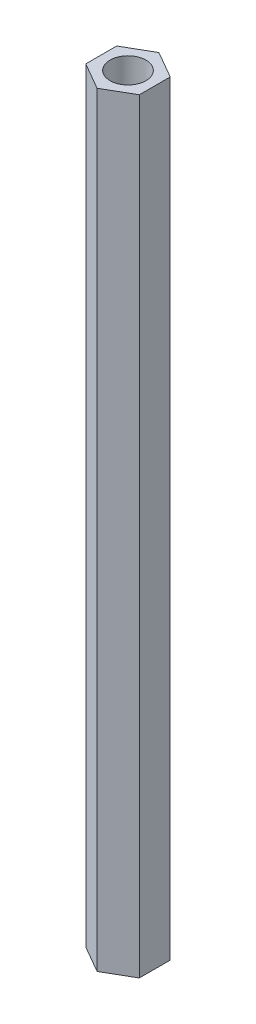
ISO-10303-21;
HEADER;
FILE_DESCRIPTION(('STEP AP214'),'2;1');
FILE_NAME('part.step','',(''),(''),'','','');
FILE_SCHEMA(('AUTOMOTIVE_DESIGN { 1 0 10303 214 1 1 1 1 }'));
ENDSEC;
DATA;
#1=APPLICATION_CONTEXT('core data for automotive mechanical design processes');
#2=APPLICATION_PROTOCOL_DEFINITION('international standard','automotive_design',2000,#1);
#3=PRODUCT_CONTEXT('',#1,'mechanical');
#4=PRODUCT('Part','Part','',(#3));
#5=PRODUCT_RELATED_PRODUCT_CATEGORY('part','',(#4));
#6=PRODUCT_DEFINITION_FORMATION('','',#4);
#7=PRODUCT_DEFINITION_CONTEXT('part definition',#1,'design');
#8=PRODUCT_DEFINITION('design','',#6,#7);
#9=PRODUCT_DEFINITION_SHAPE('','',#8);
#10=(LENGTH_UNIT() NAMED_UNIT(*) SI_UNIT(.MILLI.,.METRE.));
#11=(NAMED_UNIT(*) PLANE_ANGLE_UNIT() SI_UNIT($,.RADIAN.));
#12=(NAMED_UNIT(*) SI_UNIT($,.STERADIAN.) SOLID_ANGLE_UNIT());
#13=UNCERTAINTY_MEASURE_WITH_UNIT(LENGTH_MEASURE(1.E-05),#10,'distance_accuracy_value','');
#14=(GEOMETRIC_REPRESENTATION_CONTEXT(3) GLOBAL_UNCERTAINTY_ASSIGNED_CONTEXT((#13)) GLOBAL_UNIT_ASSIGNED_CONTEXT((#10,
#11,#12)) REPRESENTATION_CONTEXT('',''));
#15=CARTESIAN_POINT('',(0.,0.,0.));
#16=DIRECTION('',(0.,0.,1.));
#17=DIRECTION('',(1.,0.,0.));
#18=AXIS2_PLACEMENT_3D('',#15,#16,#17);
#19=CARTESIAN_POINT('',(0.,50.8,0.));
#20=DIRECTION('',(0.,1.,0.));
#21=DIRECTION('',(0.,0.,1.));
#22=AXIS2_PLACEMENT_3D('',#19,#20,#21);
#23=PLANE('',#22);
#24=DIRECTION('',(0.866025403784438,0.,0.5));
#25=VECTOR('',#24,1.);
#26=CARTESIAN_POINT('',(-1.778,50.8,1.02652877861915));
#27=LINE('',#26,#25);
#28=CARTESIAN_POINT('',(-1.778,50.8,1.02652877861915));
#29=VERTEX_POINT('',#28);
#30=CARTESIAN_POINT('',(0.,50.8,2.05305755723831));
#31=VERTEX_POINT('',#30);
#32=EDGE_CURVE('E129',#29,#31,#27,.T.);
#33=ORIENTED_EDGE('',*,*,#32,.T.);
#34=DIRECTION('',(0.866025403784439,0.,-0.5));
#35=VECTOR('',#34,1.);
#36=CARTESIAN_POINT('',(0.,50.8,2.05305755723831));
#37=LINE('',#36,#35);
#38=CARTESIAN_POINT('',(1.778,50.8,1.02652877861915));
#39=VERTEX_POINT('',#38);
#40=EDGE_CURVE('E87',#31,#39,#37,.T.);
#41=ORIENTED_EDGE('',*,*,#40,.T.);
#42=DIRECTION('',(0.,0.,-1.));
#43=VECTOR('',#42,1.);
#44=CARTESIAN_POINT('',(1.778,50.8,1.02652877861915));
#45=LINE('',#44,#43);
#46=CARTESIAN_POINT('',(1.778,50.8,-1.02652877861915));
#47=VERTEX_POINT('',#46);
#48=EDGE_CURVE('E100',#39,#47,#45,.T.);
#49=ORIENTED_EDGE('',*,*,#48,.T.);
#50=DIRECTION('',(-0.866025403784439,0.,-0.5));
#51=VECTOR('',#50,1.);
#52=CARTESIAN_POINT('',(1.778,50.8,-1.02652877861915));
#53=LINE('',#52,#51);
#54=CARTESIAN_POINT('',(0.,50.8,-2.05305755723831));
#55=VERTEX_POINT('',#54);
#56=EDGE_CURVE('E94',#47,#55,#53,.T.);
#57=ORIENTED_EDGE('',*,*,#56,.T.);
#58=DIRECTION('',(-0.866025403784439,0.,0.5));
#59=VECTOR('',#58,1.);
#60=CARTESIAN_POINT('',(0.,50.8,-2.05305755723831));
#61=LINE('',#60,#59);
#62=CARTESIAN_POINT('',(-1.778,50.8,-1.02652877861915));
#63=VERTEX_POINT('',#62);
#64=EDGE_CURVE('E98',#55,#63,#61,.T.);
#65=ORIENTED_EDGE('',*,*,#64,.T.);
#66=DIRECTION('',(0.,0.,1.));
#67=VECTOR('',#66,1.);
#68=CARTESIAN_POINT('',(-1.778,50.8,-1.02652877861915));
#69=LINE('',#68,#67);
#70=EDGE_CURVE('E50',#63,#29,#69,.T.);
#71=ORIENTED_EDGE('',*,*,#70,.T.);
#72=EDGE_LOOP('',(#33,#41,#49,#57,#65,#71));
#73=FACE_BOUND('',#72,.T.);
#74=CARTESIAN_POINT('',(0.,50.8,0.));
#75=DIRECTION('',(0.,1.,0.));
#76=DIRECTION('',(0.,0.,1.));
#77=AXIS2_PLACEMENT_3D('',#74,#75,#76);
#78=CIRCLE('',#77,1.190625);
#79=CARTESIAN_POINT('',(0.,50.8,1.190625));
#80=VERTEX_POINT('',#79);
#81=EDGE_CURVE('E122',#80,#80,#78,.T.);
#82=ORIENTED_EDGE('',*,*,#81,.F.);
#83=EDGE_LOOP('',(#82));
#84=FACE_BOUND('',#83,.T.);
#85=ADVANCED_FACE('F33',(#73,#84),#23,.T.);
#86=CARTESIAN_POINT('',(0.,0.,0.));
#87=DIRECTION('',(0.,1.,0.));
#88=DIRECTION('',(0.,0.,1.));
#89=AXIS2_PLACEMENT_3D('',#86,#87,#88);
#90=PLANE('',#89);
#91=DIRECTION('',(0.866025403784438,0.,0.5));
#92=VECTOR('',#91,1.);
#93=CARTESIAN_POINT('',(-1.778,0.,1.02652877861915));
#94=LINE('',#93,#92);
#95=CARTESIAN_POINT('',(-1.778,0.,1.02652877861915));
#96=VERTEX_POINT('',#95);
#97=CARTESIAN_POINT('',(0.,0.,2.05305755723831));
#98=VERTEX_POINT('',#97);
#99=EDGE_CURVE('E118',#96,#98,#94,.T.);
#100=ORIENTED_EDGE('',*,*,#99,.F.);
#101=DIRECTION('',(0.,0.,1.));
#102=VECTOR('',#101,1.);
#103=CARTESIAN_POINT('',(-1.778,0.,-1.02652877861915));
#104=LINE('',#103,#102);
#105=CARTESIAN_POINT('',(-1.778,0.,-1.02652877861915));
#106=VERTEX_POINT('',#105);
#107=EDGE_CURVE('E79',#106,#96,#104,.T.);
#108=ORIENTED_EDGE('',*,*,#107,.F.);
#109=DIRECTION('',(-0.866025403784439,0.,0.5));
#110=VECTOR('',#109,1.);
#111=CARTESIAN_POINT('',(0.,0.,-2.05305755723831));
#112=LINE('',#111,#110);
#113=CARTESIAN_POINT('',(0.,0.,-2.05305755723831));
#114=VERTEX_POINT('',#113);
#115=EDGE_CURVE('E73',#114,#106,#112,.T.);
#116=ORIENTED_EDGE('',*,*,#115,.F.);
#117=DIRECTION('',(-0.866025403784439,0.,-0.5));
#118=VECTOR('',#117,1.);
#119=CARTESIAN_POINT('',(1.778,0.,-1.02652877861915));
#120=LINE('',#119,#118);
#121=CARTESIAN_POINT('',(1.778,0.,-1.02652877861915));
#122=VERTEX_POINT('',#121);
#123=EDGE_CURVE('E108',#122,#114,#120,.T.);
#124=ORIENTED_EDGE('',*,*,#123,.F.);
#125=DIRECTION('',(0.,0.,-1.));
#126=VECTOR('',#125,1.);
#127=CARTESIAN_POINT('',(1.778,0.,1.02652877861915));
#128=LINE('',#127,#126);
#129=CARTESIAN_POINT('',(1.778,0.,1.02652877861915));
#130=VERTEX_POINT('',#129);
#131=EDGE_CURVE('E124',#130,#122,#128,.T.);
#132=ORIENTED_EDGE('',*,*,#131,.F.);
#133=DIRECTION('',(0.866025403784439,0.,-0.5));
#134=VECTOR('',#133,1.);
#135=CARTESIAN_POINT('',(0.,0.,2.05305755723831));
#136=LINE('',#135,#134);
#137=EDGE_CURVE('E121',#98,#130,#136,.T.);
#138=ORIENTED_EDGE('',*,*,#137,.F.);
#139=EDGE_LOOP('',(#100,#108,#116,#124,#132,#138));
#140=FACE_BOUND('',#139,.T.);
#141=CARTESIAN_POINT('',(0.,0.,0.));
#142=DIRECTION('',(0.,1.,0.));
#143=DIRECTION('',(0.,0.,1.));
#144=AXIS2_PLACEMENT_3D('',#141,#142,#143);
#145=CIRCLE('',#144,1.190625);
#146=CARTESIAN_POINT('',(0.,0.,1.190625));
#147=VERTEX_POINT('',#146);
#148=EDGE_CURVE('E222',#147,#147,#145,.T.);
#149=ORIENTED_EDGE('',*,*,#148,.T.);
#150=EDGE_LOOP('',(#149));
#151=FACE_BOUND('',#150,.T.);
#152=ADVANCED_FACE('F138',(#140,#151),#90,.F.);
#153=CARTESIAN_POINT('',(-1.778,50.8,1.02652877861915));
#154=DIRECTION('',(0.5,0.,-0.866025403784438));
#155=DIRECTION('',(-0.866025403784439,0.,-0.5));
#156=AXIS2_PLACEMENT_3D('',#153,#154,#155);
#157=PLANE('',#156);
#158=ORIENTED_EDGE('',*,*,#99,.T.);
#159=DIRECTION('',(0.,-1.,0.));
#160=VECTOR('',#159,1.);
#161=CARTESIAN_POINT('',(0.,50.8,2.05305755723831));
#162=LINE('',#161,#160);
#163=EDGE_CURVE('E11',#31,#98,#162,.T.);
#164=ORIENTED_EDGE('',*,*,#163,.F.);
#165=ORIENTED_EDGE('',*,*,#32,.F.);
#166=DIRECTION('',(0.,-1.,0.));
#167=VECTOR('',#166,1.);
#168=CARTESIAN_POINT('',(-1.778,50.8,1.02652877861915));
#169=LINE('',#168,#167);
#170=EDGE_CURVE('E114',#29,#96,#169,.T.);
#171=ORIENTED_EDGE('',*,*,#170,.T.);
#172=EDGE_LOOP('',(#158,#164,#165,#171));
#173=FACE_BOUND('',#172,.T.);
#174=ADVANCED_FACE('F35',(#173),#157,.F.);
#175=CARTESIAN_POINT('',(0.,50.8,2.05305755723831));
#176=DIRECTION('',(-0.5,0.,-0.866025403784439));
#177=DIRECTION('',(-0.866025403784439,0.,0.5));
#178=AXIS2_PLACEMENT_3D('',#175,#176,#177);
#179=PLANE('',#178);
#180=ORIENTED_EDGE('',*,*,#137,.T.);
#181=DIRECTION('',(0.,-1.,0.));
#182=VECTOR('',#181,1.);
#183=CARTESIAN_POINT('',(1.778,50.8,1.02652877861915));
#184=LINE('',#183,#182);
#185=EDGE_CURVE('E42',#39,#130,#184,.T.);
#186=ORIENTED_EDGE('',*,*,#185,.F.);
#187=ORIENTED_EDGE('',*,*,#40,.F.);
#188=ORIENTED_EDGE('',*,*,#163,.T.);
#189=EDGE_LOOP('',(#180,#186,#187,#188));
#190=FACE_BOUND('',#189,.T.);
#191=ADVANCED_FACE('F163',(#190),#179,.F.);
#192=CARTESIAN_POINT('',(1.778,50.8,1.02652877861915));
#193=DIRECTION('',(-1.,0.,0.));
#194=DIRECTION('',(0.,0.,1.));
#195=AXIS2_PLACEMENT_3D('',#192,#193,#194);
#196=PLANE('',#195);
#197=ORIENTED_EDGE('',*,*,#131,.T.);
#198=DIRECTION('',(0.,-1.,0.));
#199=VECTOR('',#198,1.);
#200=CARTESIAN_POINT('',(1.778,50.8,-1.02652877861915));
#201=LINE('',#200,#199);
#202=EDGE_CURVE('E109',#47,#122,#201,.T.);
#203=ORIENTED_EDGE('',*,*,#202,.F.);
#204=ORIENTED_EDGE('',*,*,#48,.F.);
#205=ORIENTED_EDGE('',*,*,#185,.T.);
#206=EDGE_LOOP('',(#197,#203,#204,#205));
#207=FACE_BOUND('',#206,.T.);
#208=ADVANCED_FACE('F135',(#207),#196,.F.);
#209=CARTESIAN_POINT('',(1.778,50.8,-1.02652877861915));
#210=DIRECTION('',(-0.5,0.,0.866025403784439));
#211=DIRECTION('',(0.866025403784439,0.,0.5));
#212=AXIS2_PLACEMENT_3D('',#209,#210,#211);
#213=PLANE('',#212);
#214=ORIENTED_EDGE('',*,*,#123,.T.);
#215=DIRECTION('',(0.,-1.,0.));
#216=VECTOR('',#215,1.);
#217=CARTESIAN_POINT('',(0.,50.8,-2.05305755723831));
#218=LINE('',#217,#216);
#219=EDGE_CURVE('E105',#55,#114,#218,.T.);
#220=ORIENTED_EDGE('',*,*,#219,.F.);
#221=ORIENTED_EDGE('',*,*,#56,.F.);
#222=ORIENTED_EDGE('',*,*,#202,.T.);
#223=EDGE_LOOP('',(#214,#220,#221,#222));
#224=FACE_BOUND('',#223,.T.);
#225=ADVANCED_FACE('F106',(#224),#213,.F.);
#226=CARTESIAN_POINT('',(0.,50.8,-2.05305755723831));
#227=DIRECTION('',(0.5,0.,0.866025403784439));
#228=DIRECTION('',(0.866025403784439,0.,-0.5));
#229=AXIS2_PLACEMENT_3D('',#226,#227,#228);
#230=PLANE('',#229);
#231=ORIENTED_EDGE('',*,*,#115,.T.);
#232=DIRECTION('',(0.,-1.,0.));
#233=VECTOR('',#232,1.);
#234=CARTESIAN_POINT('',(-1.778,50.8,-1.02652877861915));
#235=LINE('',#234,#233);
#236=EDGE_CURVE('E110',#63,#106,#235,.T.);
#237=ORIENTED_EDGE('',*,*,#236,.F.);
#238=ORIENTED_EDGE('',*,*,#64,.F.);
#239=ORIENTED_EDGE('',*,*,#219,.T.);
#240=EDGE_LOOP('',(#231,#237,#238,#239));
#241=FACE_BOUND('',#240,.T.);
#242=ADVANCED_FACE('F112',(#241),#230,.F.);
#243=CARTESIAN_POINT('',(-1.778,50.8,-1.02652877861915));
#244=DIRECTION('',(1.,0.,0.));
#245=DIRECTION('',(0.,0.,-1.));
#246=AXIS2_PLACEMENT_3D('',#243,#244,#245);
#247=PLANE('',#246);
#248=ORIENTED_EDGE('',*,*,#107,.T.);
#249=ORIENTED_EDGE('',*,*,#170,.F.);
#250=ORIENTED_EDGE('',*,*,#70,.F.);
#251=ORIENTED_EDGE('',*,*,#236,.T.);
#252=EDGE_LOOP('',(#248,#249,#250,#251));
#253=FACE_BOUND('',#252,.T.);
#254=ADVANCED_FACE('F143',(#253),#247,.F.);
#255=CARTESIAN_POINT('',(0.,50.8,0.));
#256=DIRECTION('',(0.,-1.,0.));
#257=DIRECTION('',(0.,0.,-1.));
#258=AXIS2_PLACEMENT_3D('',#255,#256,#257);
#259=CYLINDRICAL_SURFACE('',#258,1.190625);
#260=ORIENTED_EDGE('',*,*,#81,.T.);
#261=EDGE_LOOP('',(#260));
#262=FACE_BOUND('',#261,.T.);
#263=ORIENTED_EDGE('',*,*,#148,.F.);
#264=EDGE_LOOP('',(#263));
#265=FACE_BOUND('',#264,.T.);
#266=ADVANCED_FACE('F145',(#262,#265),#259,.F.);
#267=CLOSED_SHELL('',(#85,#152,#174,#191,#208,#225,#242,#254,#266));
#268=MANIFOLD_SOLID_BREP('B2',#267);
#269=ADVANCED_BREP_SHAPE_REPRESENTATION('',(#18,#268),#14);
#270=SHAPE_DEFINITION_REPRESENTATION(#9,#269);
ENDSEC;
END-ISO-10303-21;
